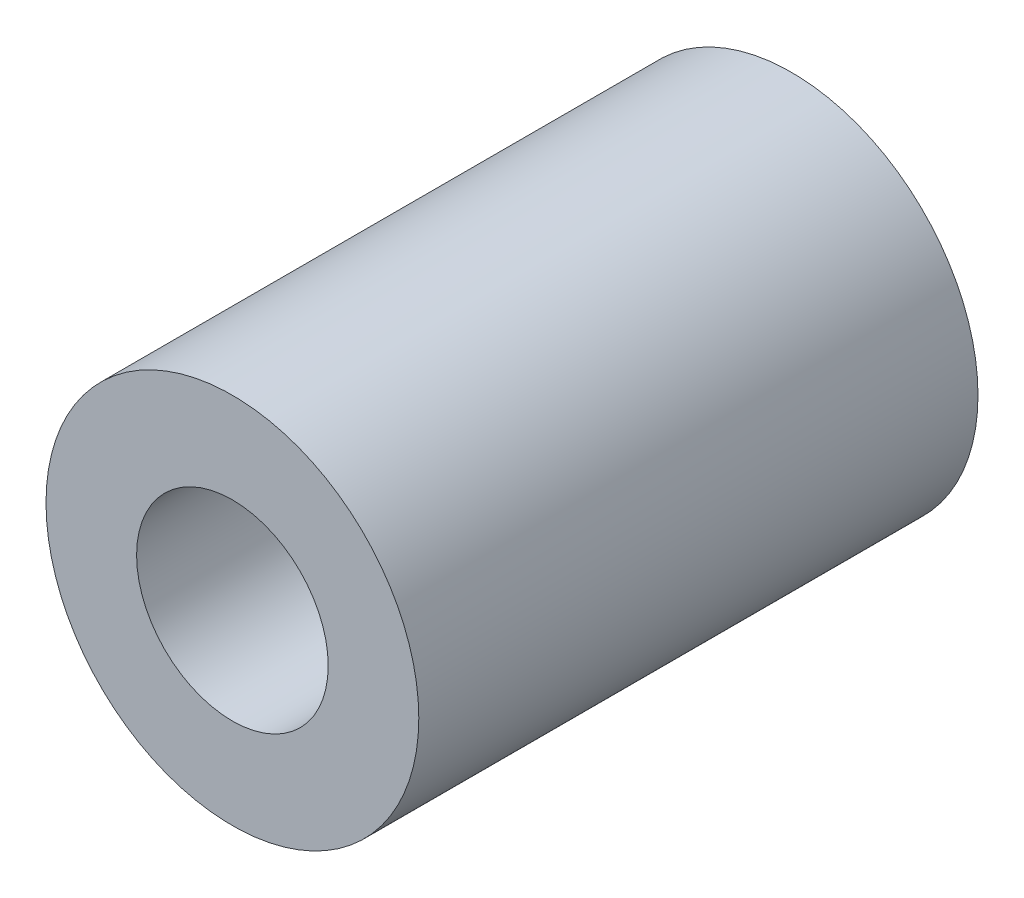
ISO-10303-21;
HEADER;
FILE_DESCRIPTION(('STEP AP214'),'2;1');
FILE_NAME('part.step','',(''),(''),'','','');
FILE_SCHEMA(('AUTOMOTIVE_DESIGN { 1 0 10303 214 1 1 1 1 }'));
ENDSEC;
DATA;
#1=APPLICATION_CONTEXT('core data for automotive mechanical design processes');
#2=APPLICATION_PROTOCOL_DEFINITION('international standard','automotive_design',2000,#1);
#3=PRODUCT_CONTEXT('',#1,'mechanical');
#4=PRODUCT('Part','Part','',(#3));
#5=PRODUCT_RELATED_PRODUCT_CATEGORY('part','',(#4));
#6=PRODUCT_DEFINITION_FORMATION('','',#4);
#7=PRODUCT_DEFINITION_CONTEXT('part definition',#1,'design');
#8=PRODUCT_DEFINITION('design','',#6,#7);
#9=PRODUCT_DEFINITION_SHAPE('','',#8);
#10=(LENGTH_UNIT() NAMED_UNIT(*) SI_UNIT(.MILLI.,.METRE.));
#11=(NAMED_UNIT(*) PLANE_ANGLE_UNIT() SI_UNIT($,.RADIAN.));
#12=(NAMED_UNIT(*) SI_UNIT($,.STERADIAN.) SOLID_ANGLE_UNIT());
#13=UNCERTAINTY_MEASURE_WITH_UNIT(LENGTH_MEASURE(1.E-05),#10,'distance_accuracy_value','');
#14=(GEOMETRIC_REPRESENTATION_CONTEXT(3) GLOBAL_UNCERTAINTY_ASSIGNED_CONTEXT((#13)) GLOBAL_UNIT_ASSIGNED_CONTEXT((#10,
#11,#12)) REPRESENTATION_CONTEXT('',''));
#15=CARTESIAN_POINT('',(0.,0.,0.));
#16=DIRECTION('',(0.,0.,1.));
#17=DIRECTION('',(1.,0.,0.));
#18=AXIS2_PLACEMENT_3D('',#15,#16,#17);
#19=CARTESIAN_POINT('',(0.,0.,19.05));
#20=DIRECTION('',(0.,0.,-1.));
#21=DIRECTION('',(-1.,0.,0.));
#22=AXIS2_PLACEMENT_3D('',#19,#20,#21);
#23=CYLINDRICAL_SURFACE('',#22,3.2639);
#24=CARTESIAN_POINT('',(0.,0.,19.05));
#25=DIRECTION('',(0.,0.,1.));
#26=DIRECTION('',(1.,0.,0.));
#27=AXIS2_PLACEMENT_3D('',#24,#25,#26);
#28=CIRCLE('',#27,3.2639);
#29=CARTESIAN_POINT('',(-3.2639,0.,19.05));
#30=VERTEX_POINT('',#29);
#31=EDGE_CURVE('E40',#30,#30,#28,.T.);
#32=CARTESIAN_POINT('',(0.,0.,0.));
#33=DIRECTION('',(0.,0.,1.));
#34=DIRECTION('',(1.,0.,0.));
#35=AXIS2_PLACEMENT_3D('',#32,#33,#34);
#36=CIRCLE('',#35,3.2639);
#37=CARTESIAN_POINT('',(-3.2639,0.,0.));
#38=VERTEX_POINT('',#37);
#39=EDGE_CURVE('E46',#38,#38,#36,.T.);
#40=CARTESIAN_POINT('',(-3.2639,0.,19.05));
#41=CARTESIAN_POINT('',(-3.2639,0.,18.8515625));
#42=CARTESIAN_POINT('',(-3.2639,0.,18.653125));
#43=CARTESIAN_POINT('',(-3.2639,0.,18.25625));
#44=CARTESIAN_POINT('',(-3.2639,0.,18.0578125));
#45=CARTESIAN_POINT('',(-3.2639,0.,17.6609375));
#46=CARTESIAN_POINT('',(-3.2639,0.,17.4625));
#47=CARTESIAN_POINT('',(-3.2639,0.,17.065625));
#48=CARTESIAN_POINT('',(-3.2639,0.,16.8671875));
#49=CARTESIAN_POINT('',(-3.2639,0.,16.4703125));
#50=CARTESIAN_POINT('',(-3.2639,0.,16.271875));
#51=CARTESIAN_POINT('',(-3.2639,0.,15.875));
#52=CARTESIAN_POINT('',(-3.2639,0.,15.6765625));
#53=CARTESIAN_POINT('',(-3.2639,0.,15.2796875));
#54=CARTESIAN_POINT('',(-3.2639,0.,15.08125));
#55=CARTESIAN_POINT('',(-3.2639,0.,14.684375));
#56=CARTESIAN_POINT('',(-3.2639,0.,14.4859375));
#57=CARTESIAN_POINT('',(-3.2639,0.,14.0890625));
#58=CARTESIAN_POINT('',(-3.2639,0.,13.890625));
#59=CARTESIAN_POINT('',(-3.2639,0.,13.49375));
#60=CARTESIAN_POINT('',(-3.2639,0.,13.2953125));
#61=CARTESIAN_POINT('',(-3.2639,0.,12.8984375));
#62=CARTESIAN_POINT('',(-3.2639,0.,12.7));
#63=CARTESIAN_POINT('',(-3.2639,0.,12.303125));
#64=CARTESIAN_POINT('',(-3.2639,0.,12.1046875));
#65=CARTESIAN_POINT('',(-3.2639,0.,11.7078125));
#66=CARTESIAN_POINT('',(-3.2639,0.,11.509375));
#67=CARTESIAN_POINT('',(-3.2639,0.,11.1125));
#68=CARTESIAN_POINT('',(-3.2639,0.,10.9140625));
#69=CARTESIAN_POINT('',(-3.2639,0.,10.5171875));
#70=CARTESIAN_POINT('',(-3.2639,0.,10.31875));
#71=CARTESIAN_POINT('',(-3.2639,0.,9.921875));
#72=CARTESIAN_POINT('',(-3.2639,0.,9.7234375));
#73=CARTESIAN_POINT('',(-3.2639,0.,9.3265625));
#74=CARTESIAN_POINT('',(-3.2639,0.,9.128125));
#75=CARTESIAN_POINT('',(-3.2639,0.,8.73125));
#76=CARTESIAN_POINT('',(-3.2639,0.,8.5328125));
#77=CARTESIAN_POINT('',(-3.2639,0.,8.1359375));
#78=CARTESIAN_POINT('',(-3.2639,0.,7.9375));
#79=CARTESIAN_POINT('',(-3.2639,0.,7.540625));
#80=CARTESIAN_POINT('',(-3.2639,0.,7.3421875));
#81=CARTESIAN_POINT('',(-3.2639,0.,6.9453125));
#82=CARTESIAN_POINT('',(-3.2639,0.,6.746875));
#83=CARTESIAN_POINT('',(-3.2639,0.,6.35));
#84=CARTESIAN_POINT('',(-3.2639,0.,6.1515625));
#85=CARTESIAN_POINT('',(-3.2639,0.,5.7546875));
#86=CARTESIAN_POINT('',(-3.2639,0.,5.55625));
#87=CARTESIAN_POINT('',(-3.2639,0.,5.159375));
#88=CARTESIAN_POINT('',(-3.2639,0.,4.9609375));
#89=CARTESIAN_POINT('',(-3.2639,0.,4.5640625));
#90=CARTESIAN_POINT('',(-3.2639,0.,4.365625));
#91=CARTESIAN_POINT('',(-3.2639,0.,3.96875));
#92=CARTESIAN_POINT('',(-3.2639,0.,3.7703125));
#93=CARTESIAN_POINT('',(-3.2639,0.,3.3734375));
#94=CARTESIAN_POINT('',(-3.2639,0.,3.175));
#95=CARTESIAN_POINT('',(-3.2639,0.,2.778125));
#96=CARTESIAN_POINT('',(-3.2639,0.,2.5796875));
#97=CARTESIAN_POINT('',(-3.2639,0.,2.1828125));
#98=CARTESIAN_POINT('',(-3.2639,0.,1.984375));
#99=CARTESIAN_POINT('',(-3.2639,0.,1.5875));
#100=CARTESIAN_POINT('',(-3.2639,0.,1.3890625));
#101=CARTESIAN_POINT('',(-3.2639,0.,0.992187500000001));
#102=CARTESIAN_POINT('',(-3.2639,0.,0.793750000000001));
#103=CARTESIAN_POINT('',(-3.2639,0.,0.396875));
#104=CARTESIAN_POINT('',(-3.2639,0.,0.1984375));
#105=CARTESIAN_POINT('',(-3.2639,0.,0.));
#106=B_SPLINE_CURVE_WITH_KNOTS('',3,(#40,#41,#42,#43,#44,#45,#46,#47,#48,#49,#50,#51,#52,#53,
#54,#55,#56,#57,#58,#59,#60,#61,#62,#63,#64,#65,#66,#67,#68,#69,#70,#71,#72,#73,#74,#75,#76,#77,
#78,#79,#80,#81,#82,#83,#84,#85,#86,#87,#88,#89,#90,#91,#92,#93,#94,#95,#96,#97,#98,#99,#100,
#101,#102,#103,#104,#105),.UNSPECIFIED.,.F.,.F.,(4,2,2,2,2,2,2,2,2,2,2,2,2,2,2,2,2,2,2,2,2,2,2,
2,2,2,2,2,2,2,2,2,4),(0.,0.595312499999997,1.190625,1.7859375,2.38125,2.9765625,3.571875,
4.1671875,4.7625,5.3578125,5.953125,6.5484375,7.14375,7.7390625,8.334375,8.9296875,9.525,
10.1203125,10.715625,11.3109375,11.90625,12.5015625,13.096875,13.6921875,14.2875,14.8828125,
15.478125,16.0734375,16.66875,17.2640625,17.859375,18.4546875,19.05),.UNSPECIFIED.);
#107=EDGE_CURVE('BSEAM33',#30,#38,#106,.T.);
#108=ORIENTED_EDGE('',*,*,#31,.T.);
#109=ORIENTED_EDGE('',*,*,#39,.F.);
#110=ORIENTED_EDGE('',*,*,#107,.T.);
#111=ORIENTED_EDGE('',*,*,#107,.F.);
#112=EDGE_LOOP('',(#108,#110,#109,#111));
#113=FACE_BOUND('',#112,.T.);
#114=ADVANCED_FACE('F33',(#113),#23,.F.);
#115=CARTESIAN_POINT('',(0.,0.,19.05));
#116=DIRECTION('',(0.,0.,-1.));
#117=DIRECTION('',(-1.,0.,0.));
#118=AXIS2_PLACEMENT_3D('',#115,#116,#117);
#119=CYLINDRICAL_SURFACE('',#118,6.35);
#120=CARTESIAN_POINT('',(0.,0.,19.05));
#121=DIRECTION('',(0.,0.,1.));
#122=DIRECTION('',(1.,0.,0.));
#123=AXIS2_PLACEMENT_3D('',#120,#121,#122);
#124=CIRCLE('',#123,6.35);
#125=CARTESIAN_POINT('',(-6.35,0.,19.05));
#126=VERTEX_POINT('',#125);
#127=EDGE_CURVE('E10',#126,#126,#124,.T.);
#128=CARTESIAN_POINT('',(0.,0.,0.));
#129=DIRECTION('',(0.,0.,1.));
#130=DIRECTION('',(1.,0.,0.));
#131=AXIS2_PLACEMENT_3D('',#128,#129,#130);
#132=CIRCLE('',#131,6.35);
#133=CARTESIAN_POINT('',(-6.35,0.,0.));
#134=VERTEX_POINT('',#133);
#135=EDGE_CURVE('E36',#134,#134,#132,.T.);
#136=CARTESIAN_POINT('',(-6.35,0.,19.05));
#137=CARTESIAN_POINT('',(-6.35,0.,18.8515625));
#138=CARTESIAN_POINT('',(-6.35,0.,18.653125));
#139=CARTESIAN_POINT('',(-6.35,0.,18.25625));
#140=CARTESIAN_POINT('',(-6.35,0.,18.0578125));
#141=CARTESIAN_POINT('',(-6.35,0.,17.6609375));
#142=CARTESIAN_POINT('',(-6.35,0.,17.4625));
#143=CARTESIAN_POINT('',(-6.35,0.,17.065625));
#144=CARTESIAN_POINT('',(-6.35,0.,16.8671875));
#145=CARTESIAN_POINT('',(-6.35,0.,16.4703125));
#146=CARTESIAN_POINT('',(-6.35,0.,16.271875));
#147=CARTESIAN_POINT('',(-6.35,0.,15.875));
#148=CARTESIAN_POINT('',(-6.35,0.,15.6765625));
#149=CARTESIAN_POINT('',(-6.35,0.,15.2796875));
#150=CARTESIAN_POINT('',(-6.35,0.,15.08125));
#151=CARTESIAN_POINT('',(-6.35,0.,14.684375));
#152=CARTESIAN_POINT('',(-6.35,0.,14.4859375));
#153=CARTESIAN_POINT('',(-6.35,0.,14.0890625));
#154=CARTESIAN_POINT('',(-6.35,0.,13.890625));
#155=CARTESIAN_POINT('',(-6.35,0.,13.49375));
#156=CARTESIAN_POINT('',(-6.35,0.,13.2953125));
#157=CARTESIAN_POINT('',(-6.35,0.,12.8984375));
#158=CARTESIAN_POINT('',(-6.35,0.,12.7));
#159=CARTESIAN_POINT('',(-6.35,0.,12.303125));
#160=CARTESIAN_POINT('',(-6.35,0.,12.1046875));
#161=CARTESIAN_POINT('',(-6.35,0.,11.7078125));
#162=CARTESIAN_POINT('',(-6.35,0.,11.509375));
#163=CARTESIAN_POINT('',(-6.35,0.,11.1125));
#164=CARTESIAN_POINT('',(-6.35,0.,10.9140625));
#165=CARTESIAN_POINT('',(-6.35,0.,10.5171875));
#166=CARTESIAN_POINT('',(-6.35,0.,10.31875));
#167=CARTESIAN_POINT('',(-6.35,0.,9.921875));
#168=CARTESIAN_POINT('',(-6.35,0.,9.7234375));
#169=CARTESIAN_POINT('',(-6.35,0.,9.3265625));
#170=CARTESIAN_POINT('',(-6.35,0.,9.128125));
#171=CARTESIAN_POINT('',(-6.35,0.,8.73125));
#172=CARTESIAN_POINT('',(-6.35,0.,8.5328125));
#173=CARTESIAN_POINT('',(-6.35,0.,8.1359375));
#174=CARTESIAN_POINT('',(-6.35,0.,7.9375));
#175=CARTESIAN_POINT('',(-6.35,0.,7.540625));
#176=CARTESIAN_POINT('',(-6.35,0.,7.3421875));
#177=CARTESIAN_POINT('',(-6.35,0.,6.9453125));
#178=CARTESIAN_POINT('',(-6.35,0.,6.746875));
#179=CARTESIAN_POINT('',(-6.35,0.,6.35));
#180=CARTESIAN_POINT('',(-6.35,0.,6.1515625));
#181=CARTESIAN_POINT('',(-6.35,0.,5.7546875));
#182=CARTESIAN_POINT('',(-6.35,0.,5.55625));
#183=CARTESIAN_POINT('',(-6.35,0.,5.159375));
#184=CARTESIAN_POINT('',(-6.35,0.,4.9609375));
#185=CARTESIAN_POINT('',(-6.35,0.,4.5640625));
#186=CARTESIAN_POINT('',(-6.35,0.,4.365625));
#187=CARTESIAN_POINT('',(-6.35,0.,3.96875));
#188=CARTESIAN_POINT('',(-6.35,0.,3.7703125));
#189=CARTESIAN_POINT('',(-6.35,0.,3.3734375));
#190=CARTESIAN_POINT('',(-6.35,0.,3.175));
#191=CARTESIAN_POINT('',(-6.35,0.,2.778125));
#192=CARTESIAN_POINT('',(-6.35,0.,2.5796875));
#193=CARTESIAN_POINT('',(-6.35,0.,2.1828125));
#194=CARTESIAN_POINT('',(-6.35,0.,1.984375));
#195=CARTESIAN_POINT('',(-6.35,0.,1.5875));
#196=CARTESIAN_POINT('',(-6.35,0.,1.3890625));
#197=CARTESIAN_POINT('',(-6.35,0.,0.992187500000001));
#198=CARTESIAN_POINT('',(-6.35,0.,0.793750000000001));
#199=CARTESIAN_POINT('',(-6.35,0.,0.396875));
#200=CARTESIAN_POINT('',(-6.35,0.,0.1984375));
#201=CARTESIAN_POINT('',(-6.35,0.,0.));
#202=B_SPLINE_CURVE_WITH_KNOTS('',3,(#136,#137,#138,#139,#140,#141,#142,#143,#144,#145,#146,
#147,#148,#149,#150,#151,#152,#153,#154,#155,#156,#157,#158,#159,#160,#161,#162,#163,#164,#165,
#166,#167,#168,#169,#170,#171,#172,#173,#174,#175,#176,#177,#178,#179,#180,#181,#182,#183,#184,
#185,#186,#187,#188,#189,#190,#191,#192,#193,#194,#195,#196,#197,#198,#199,#200,#201),
.UNSPECIFIED.,.F.,.F.,(4,2,2,2,2,2,2,2,2,2,2,2,2,2,2,2,2,2,2,2,2,2,2,2,2,2,2,2,2,2,2,2,4),(0.,
0.5953125,1.190625,1.7859375,2.38125,2.9765625,3.571875,4.1671875,4.7625,5.3578125,5.953125,
6.5484375,7.14375,7.7390625,8.334375,8.9296875,9.525,10.1203125,10.715625,11.3109375,11.90625,
12.5015625,13.096875,13.6921875,14.2875,14.8828125,15.478125,16.0734375,16.66875,17.2640625,
17.859375,18.4546875,19.05),.UNSPECIFIED.);
#203=EDGE_CURVE('BSEAM53',#126,#134,#202,.T.);
#204=ORIENTED_EDGE('',*,*,#127,.F.);
#205=ORIENTED_EDGE('',*,*,#135,.T.);
#206=ORIENTED_EDGE('',*,*,#203,.T.);
#207=ORIENTED_EDGE('',*,*,#203,.F.);
#208=EDGE_LOOP('',(#204,#206,#205,#207));
#209=FACE_BOUND('',#208,.T.);
#210=ADVANCED_FACE('F53',(#209),#119,.T.);
#211=CARTESIAN_POINT('',(0.,0.,19.05));
#212=DIRECTION('',(0.,0.,1.));
#213=DIRECTION('',(1.,0.,0.));
#214=AXIS2_PLACEMENT_3D('',#211,#212,#213);
#215=PLANE('',#214);
#216=ORIENTED_EDGE('',*,*,#31,.F.);
#217=EDGE_LOOP('',(#216));
#218=FACE_BOUND('',#217,.T.);
#219=ORIENTED_EDGE('',*,*,#127,.T.);
#220=EDGE_LOOP('',(#219));
#221=FACE_BOUND('',#220,.T.);
#222=ADVANCED_FACE('F57',(#218,#221),#215,.T.);
#223=CARTESIAN_POINT('',(0.,0.,0.));
#224=DIRECTION('',(0.,0.,1.));
#225=DIRECTION('',(1.,0.,0.));
#226=AXIS2_PLACEMENT_3D('',#223,#224,#225);
#227=PLANE('',#226);
#228=ORIENTED_EDGE('',*,*,#39,.T.);
#229=EDGE_LOOP('',(#228));
#230=FACE_BOUND('',#229,.T.);
#231=ORIENTED_EDGE('',*,*,#135,.F.);
#232=EDGE_LOOP('',(#231));
#233=FACE_BOUND('',#232,.T.);
#234=ADVANCED_FACE('F55',(#230,#233),#227,.F.);
#235=CLOSED_SHELL('',(#114,#210,#222,#234));
#236=MANIFOLD_SOLID_BREP('B2',#235);
#237=ADVANCED_BREP_SHAPE_REPRESENTATION('',(#18,#236),#14);
#238=SHAPE_DEFINITION_REPRESENTATION(#9,#237);
ENDSEC;
END-ISO-10303-21;
